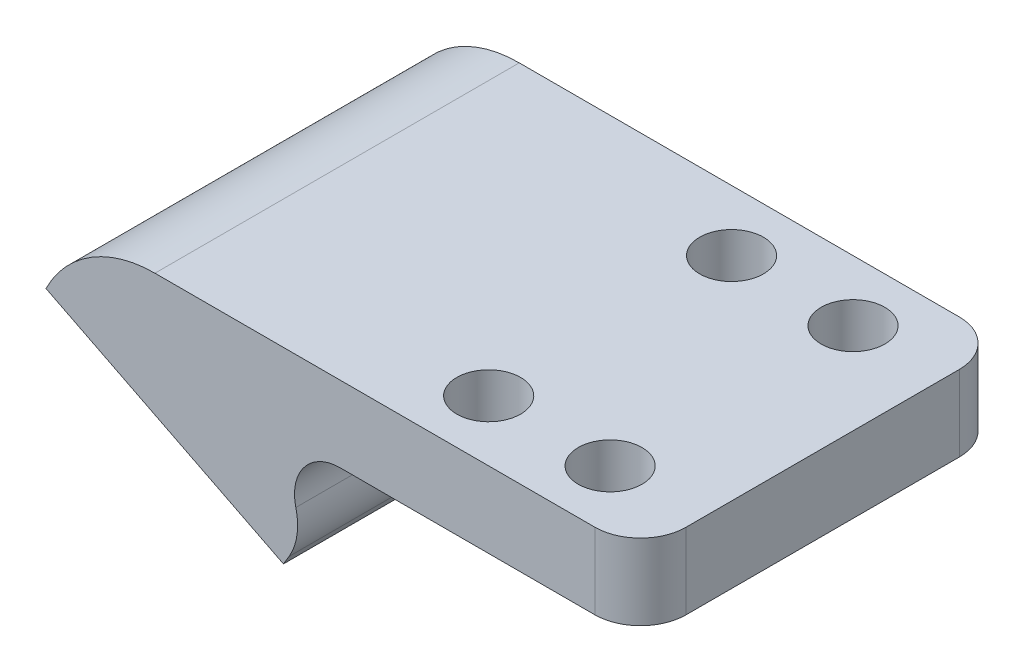
ISO-10303-21;
HEADER;
FILE_DESCRIPTION(('STEP AP214'),'2;1');
FILE_NAME('part.step','',(''),(''),'','','');
FILE_SCHEMA(('AUTOMOTIVE_DESIGN { 1 0 10303 214 1 1 1 1 }'));
ENDSEC;
DATA;
#1=APPLICATION_CONTEXT('core data for automotive mechanical design processes');
#2=APPLICATION_PROTOCOL_DEFINITION('international standard','automotive_design',2000,#1);
#3=PRODUCT_CONTEXT('',#1,'mechanical');
#4=PRODUCT('Part','Part','',(#3));
#5=PRODUCT_RELATED_PRODUCT_CATEGORY('part','',(#4));
#6=PRODUCT_DEFINITION_FORMATION('','',#4);
#7=PRODUCT_DEFINITION_CONTEXT('part definition',#1,'design');
#8=PRODUCT_DEFINITION('design','',#6,#7);
#9=PRODUCT_DEFINITION_SHAPE('','',#8);
#10=(LENGTH_UNIT() NAMED_UNIT(*) SI_UNIT(.MILLI.,.METRE.));
#11=(NAMED_UNIT(*) PLANE_ANGLE_UNIT() SI_UNIT($,.RADIAN.));
#12=(NAMED_UNIT(*) SI_UNIT($,.STERADIAN.) SOLID_ANGLE_UNIT());
#13=UNCERTAINTY_MEASURE_WITH_UNIT(LENGTH_MEASURE(1.E-05),#10,'distance_accuracy_value','');
#14=(GEOMETRIC_REPRESENTATION_CONTEXT(3) GLOBAL_UNCERTAINTY_ASSIGNED_CONTEXT((#13)) GLOBAL_UNIT_ASSIGNED_CONTEXT((#10,
#11,#12)) REPRESENTATION_CONTEXT('',''));
#15=CARTESIAN_POINT('',(0.,0.,0.));
#16=DIRECTION('',(0.,0.,1.));
#17=DIRECTION('',(1.,0.,0.));
#18=AXIS2_PLACEMENT_3D('',#15,#16,#17);
#19=CARTESIAN_POINT('',(-3.5827119850903,-7.10195779346765,0.));
#20=DIRECTION('',(-0.450402219937165,-0.892825761431464,0.));
#21=DIRECTION('',(0.892825761431464,-0.450402219937165,0.));
#22=AXIS2_PLACEMENT_3D('',#19,#20,#21);
#23=PLANE('',#22);
#24=DIRECTION('',(0.892825761431464,-0.450402219937165,0.));
#25=VECTOR('',#24,1.);
#26=CARTESIAN_POINT('',(-3.5827119850903,-7.10195779346765,24.));
#27=LINE('',#26,#25);
#28=CARTESIAN_POINT('',(-18.7230691559257,0.535871192842679,24.));
#29=VERTEX_POINT('',#28);
#30=CARTESIAN_POINT('',(-3.08050844509965,-7.35530351784442,24.));
#31=VERTEX_POINT('',#30);
#32=EDGE_CURVE('E201',#29,#31,#27,.T.);
#33=ORIENTED_EDGE('',*,*,#32,.F.);
#34=DIRECTION('',(0.,0.,1.));
#35=VECTOR('',#34,1.);
#36=CARTESIAN_POINT('',(-18.7230691559257,0.535871192842679,0.));
#37=LINE('',#36,#35);
#38=CARTESIAN_POINT('',(-18.7230691559257,0.535871192842679,0.));
#39=VERTEX_POINT('',#38);
#40=EDGE_CURVE('E218',#39,#29,#37,.T.);
#41=ORIENTED_EDGE('',*,*,#40,.F.);
#42=DIRECTION('',(0.892825761431464,-0.450402219937165,0.));
#43=VECTOR('',#42,1.);
#44=CARTESIAN_POINT('',(-3.5827119850903,-7.10195779346765,0.));
#45=LINE('',#44,#43);
#46=CARTESIAN_POINT('',(-3.08050844509965,-7.35530351784442,0.));
#47=VERTEX_POINT('',#46);
#48=EDGE_CURVE('E202',#39,#47,#45,.T.);
#49=ORIENTED_EDGE('',*,*,#48,.T.);
#50=DIRECTION('',(0.,0.,1.));
#51=VECTOR('',#50,1.);
#52=CARTESIAN_POINT('',(-3.08050844509965,-7.35530351784442,0.));
#53=LINE('',#52,#51);
#54=EDGE_CURVE('E211',#47,#31,#53,.T.);
#55=ORIENTED_EDGE('',*,*,#54,.T.);
#56=EDGE_LOOP('',(#33,#41,#49,#55));
#57=FACE_BOUND('',#56,.T.);
#58=DIRECTION('',(0.,0.,-1.));
#59=VECTOR('',#58,1.);
#60=CARTESIAN_POINT('',(-13.1338532040913,-2.28371061265796,17.));
#61=LINE('',#60,#59);
#62=CARTESIAN_POINT('',(-13.1338532040913,-2.28371061265796,17.));
#63=VERTEX_POINT('',#62);
#64=CARTESIAN_POINT('',(-13.1338532040913,-2.28371061265796,7.));
#65=VERTEX_POINT('',#64);
#66=EDGE_CURVE('E544',#63,#65,#61,.T.);
#67=ORIENTED_EDGE('',*,*,#66,.F.);
#68=CARTESIAN_POINT('',(-10.9017888005127,-3.40971616250087,17.));
#69=DIRECTION('',(-0.450402219937165,-0.892825761431464,0.));
#70=DIRECTION('',(0.892825761431464,-0.450402219937165,0.));
#71=AXIS2_PLACEMENT_3D('',#68,#69,#70);
#72=CIRCLE('',#71,2.5);
#73=CARTESIAN_POINT('',(-8.669724396934,-4.53572171234378,17.));
#74=VERTEX_POINT('',#73);
#75=EDGE_CURVE('E165',#74,#63,#72,.T.);
#76=ORIENTED_EDGE('',*,*,#75,.F.);
#77=DIRECTION('',(0.,0.,1.));
#78=VECTOR('',#77,1.);
#79=CARTESIAN_POINT('',(-8.669724396934,-4.53572171234378,17.));
#80=LINE('',#79,#78);
#81=CARTESIAN_POINT('',(-8.66972439693401,-4.53572171234379,7.));
#82=VERTEX_POINT('',#81);
#83=EDGE_CURVE('E161',#82,#74,#80,.T.);
#84=ORIENTED_EDGE('',*,*,#83,.F.);
#85=CARTESIAN_POINT('',(-10.9017888005127,-3.40971616250087,7.));
#86=DIRECTION('',(-0.450402219937165,-0.892825761431464,0.));
#87=DIRECTION('',(0.892825761431464,-0.450402219937165,0.));
#88=AXIS2_PLACEMENT_3D('',#85,#86,#87);
#89=CIRCLE('',#88,2.5);
#90=EDGE_CURVE('E541',#65,#82,#89,.T.);
#91=ORIENTED_EDGE('',*,*,#90,.F.);
#92=EDGE_LOOP('',(#67,#76,#84,#91));
#93=FACE_BOUND('',#92,.T.);
#94=ADVANCED_FACE('F35',(#57,#93),#23,.T.);
#95=CARTESIAN_POINT('',(-6.55963087060098,0.,24.));
#96=DIRECTION('',(0.,1.,0.));
#97=DIRECTION('',(0.,0.,1.));
#98=AXIS2_PLACEMENT_3D('',#95,#96,#97);
#99=PLANE('',#98);
#100=CARTESIAN_POINT('',(6.44036912939902,0.,4.));
#101=DIRECTION('',(0.,1.,0.));
#102=DIRECTION('',(0.,0.,1.));
#103=AXIS2_PLACEMENT_3D('',#100,#101,#102);
#104=CIRCLE('',#103,2.1);
#105=CARTESIAN_POINT('',(6.44036912939902,0.,6.1));
#106=VERTEX_POINT('',#105);
#107=EDGE_CURVE('E170',#106,#106,#104,.T.);
#108=ORIENTED_EDGE('',*,*,#107,.T.);
#109=EDGE_LOOP('',(#108));
#110=FACE_BOUND('',#109,.T.);
#111=CARTESIAN_POINT('',(14.440369129399,0.,4.));
#112=DIRECTION('',(0.,1.,0.));
#113=DIRECTION('',(0.,0.,1.));
#114=AXIS2_PLACEMENT_3D('',#111,#112,#113);
#115=CIRCLE('',#114,2.1);
#116=CARTESIAN_POINT('',(14.440369129399,0.,6.1));
#117=VERTEX_POINT('',#116);
#118=EDGE_CURVE('E180',#117,#117,#115,.T.);
#119=ORIENTED_EDGE('',*,*,#118,.T.);
#120=EDGE_LOOP('',(#119));
#121=FACE_BOUND('',#120,.T.);
#122=CARTESIAN_POINT('',(14.440369129399,0.,20.));
#123=DIRECTION('',(0.,1.,0.));
#124=DIRECTION('',(0.,0.,1.));
#125=AXIS2_PLACEMENT_3D('',#122,#123,#124);
#126=CIRCLE('',#125,2.1);
#127=CARTESIAN_POINT('',(14.440369129399,0.,22.1));
#128=VERTEX_POINT('',#127);
#129=EDGE_CURVE('E186',#128,#128,#126,.F.);
#130=ORIENTED_EDGE('',*,*,#129,.F.);
#131=EDGE_LOOP('',(#130));
#132=FACE_BOUND('',#131,.T.);
#133=CARTESIAN_POINT('',(6.44036912939902,0.,20.));
#134=DIRECTION('',(0.,1.,0.));
#135=DIRECTION('',(0.,0.,1.));
#136=AXIS2_PLACEMENT_3D('',#133,#134,#135);
#137=CIRCLE('',#136,2.1);
#138=CARTESIAN_POINT('',(6.44036912939902,0.,22.1));
#139=VERTEX_POINT('',#138);
#140=EDGE_CURVE('E192',#139,#139,#137,.T.);
#141=ORIENTED_EDGE('',*,*,#140,.T.);
#142=EDGE_LOOP('',(#141));
#143=FACE_BOUND('',#142,.T.);
#144=DIRECTION('',(1.,0.,0.));
#145=VECTOR('',#144,1.);
#146=CARTESIAN_POINT('',(-6.55963087060098,0.,0.));
#147=LINE('',#146,#145);
#148=CARTESIAN_POINT('',(0.647584166850476,0.,0.));
#149=VERTEX_POINT('',#148);
#150=CARTESIAN_POINT('',(17.440369129399,0.,0.));
#151=VERTEX_POINT('',#150);
#152=EDGE_CURVE('E221',#149,#151,#147,.T.);
#153=ORIENTED_EDGE('',*,*,#152,.T.);
#154=CARTESIAN_POINT('',(17.440369129399,0.,3.));
#155=DIRECTION('',(0.,1.,0.));
#156=DIRECTION('',(0.,0.,1.));
#157=AXIS2_PLACEMENT_3D('',#154,#155,#156);
#158=CIRCLE('',#157,3.);
#159=CARTESIAN_POINT('',(20.440369129399,0.,3.));
#160=VERTEX_POINT('',#159);
#161=EDGE_CURVE('E43',#151,#160,#158,.F.);
#162=ORIENTED_EDGE('',*,*,#161,.T.);
#163=DIRECTION('',(0.,0.,-1.));
#164=VECTOR('',#163,1.);
#165=CARTESIAN_POINT('',(20.440369129399,0.,0.));
#166=LINE('',#165,#164);
#167=CARTESIAN_POINT('',(20.440369129399,0.,21.));
#168=VERTEX_POINT('',#167);
#169=EDGE_CURVE('E198',#168,#160,#166,.T.);
#170=ORIENTED_EDGE('',*,*,#169,.F.);
#171=CARTESIAN_POINT('',(17.440369129399,0.,21.));
#172=DIRECTION('',(0.,1.,0.));
#173=DIRECTION('',(0.,0.,1.));
#174=AXIS2_PLACEMENT_3D('',#171,#172,#173);
#175=CIRCLE('',#174,3.);
#176=CARTESIAN_POINT('',(17.440369129399,0.,24.));
#177=VERTEX_POINT('',#176);
#178=EDGE_CURVE('E58',#168,#177,#175,.F.);
#179=ORIENTED_EDGE('',*,*,#178,.T.);
#180=DIRECTION('',(1.,0.,0.));
#181=VECTOR('',#180,1.);
#182=CARTESIAN_POINT('',(-6.55963087060098,0.,24.));
#183=LINE('',#182,#181);
#184=CARTESIAN_POINT('',(0.647584166850476,0.,24.));
#185=VERTEX_POINT('',#184);
#186=EDGE_CURVE('E223',#185,#177,#183,.T.);
#187=ORIENTED_EDGE('',*,*,#186,.F.);
#188=DIRECTION('',(0.,0.,-1.));
#189=VECTOR('',#188,1.);
#190=CARTESIAN_POINT('',(0.647584166850476,0.,24.));
#191=LINE('',#190,#189);
#192=EDGE_CURVE('E249',#185,#149,#191,.T.);
#193=ORIENTED_EDGE('',*,*,#192,.T.);
#194=EDGE_LOOP('',(#153,#162,#170,#179,#187,#193));
#195=FACE_BOUND('',#194,.T.);
#196=ADVANCED_FACE('F271',(#110,#121,#132,#143,#195),#99,.F.);
#197=CARTESIAN_POINT('',(-6.55963087060098,5.,24.));
#198=DIRECTION('',(0.,-1.,0.));
#199=DIRECTION('',(0.,0.,-1.));
#200=AXIS2_PLACEMENT_3D('',#197,#198,#199);
#201=PLANE('',#200);
#202=CARTESIAN_POINT('',(6.44036912939902,5.,4.));
#203=DIRECTION('',(0.,1.,0.));
#204=DIRECTION('',(0.,0.,1.));
#205=AXIS2_PLACEMENT_3D('',#202,#203,#204);
#206=CIRCLE('',#205,2.1);
#207=CARTESIAN_POINT('',(6.44036912939902,5.,6.1));
#208=VERTEX_POINT('',#207);
#209=EDGE_CURVE('E167',#208,#208,#206,.T.);
#210=ORIENTED_EDGE('',*,*,#209,.F.);
#211=EDGE_LOOP('',(#210));
#212=FACE_BOUND('',#211,.T.);
#213=CARTESIAN_POINT('',(14.440369129399,5.,4.));
#214=DIRECTION('',(0.,1.,0.));
#215=DIRECTION('',(0.,0.,1.));
#216=AXIS2_PLACEMENT_3D('',#213,#214,#215);
#217=CIRCLE('',#216,2.1);
#218=CARTESIAN_POINT('',(14.440369129399,5.,6.1));
#219=VERTEX_POINT('',#218);
#220=EDGE_CURVE('E177',#219,#219,#217,.T.);
#221=ORIENTED_EDGE('',*,*,#220,.F.);
#222=EDGE_LOOP('',(#221));
#223=FACE_BOUND('',#222,.T.);
#224=CARTESIAN_POINT('',(14.440369129399,5.,20.));
#225=DIRECTION('',(0.,1.,0.));
#226=DIRECTION('',(0.,0.,1.));
#227=AXIS2_PLACEMENT_3D('',#224,#225,#226);
#228=CIRCLE('',#227,2.1);
#229=CARTESIAN_POINT('',(14.440369129399,5.,22.1));
#230=VERTEX_POINT('',#229);
#231=EDGE_CURVE('E183',#230,#230,#228,.F.);
#232=ORIENTED_EDGE('',*,*,#231,.T.);
#233=EDGE_LOOP('',(#232));
#234=FACE_BOUND('',#233,.T.);
#235=CARTESIAN_POINT('',(6.44036912939902,5.,20.));
#236=DIRECTION('',(0.,1.,0.));
#237=DIRECTION('',(0.,0.,1.));
#238=AXIS2_PLACEMENT_3D('',#235,#236,#237);
#239=CIRCLE('',#238,2.1);
#240=CARTESIAN_POINT('',(6.44036912939902,5.,22.1));
#241=VERTEX_POINT('',#240);
#242=EDGE_CURVE('E189',#241,#241,#239,.T.);
#243=ORIENTED_EDGE('',*,*,#242,.F.);
#244=EDGE_LOOP('',(#243));
#245=FACE_BOUND('',#244,.T.);
#246=DIRECTION('',(0.,0.,1.));
#247=VECTOR('',#246,1.);
#248=CARTESIAN_POINT('',(20.440369129399,5.,0.));
#249=LINE('',#248,#247);
#250=CARTESIAN_POINT('',(20.440369129399,5.,3.));
#251=VERTEX_POINT('',#250);
#252=CARTESIAN_POINT('',(20.440369129399,5.,21.));
#253=VERTEX_POINT('',#252);
#254=EDGE_CURVE('E195',#251,#253,#249,.T.);
#255=ORIENTED_EDGE('',*,*,#254,.F.);
#256=CARTESIAN_POINT('',(17.440369129399,5.,3.));
#257=DIRECTION('',(0.,-1.,0.));
#258=DIRECTION('',(0.,0.,-1.));
#259=AXIS2_PLACEMENT_3D('',#256,#257,#258);
#260=CIRCLE('',#259,3.);
#261=CARTESIAN_POINT('',(17.440369129399,5.,0.));
#262=VERTEX_POINT('',#261);
#263=EDGE_CURVE('E266',#251,#262,#260,.F.);
#264=ORIENTED_EDGE('',*,*,#263,.T.);
#265=DIRECTION('',(-1.,0.,0.));
#266=VECTOR('',#265,1.);
#267=CARTESIAN_POINT('',(-6.55963087060098,5.,0.));
#268=LINE('',#267,#266);
#269=CARTESIAN_POINT('',(-11.5464888620744,5.,0.));
#270=VERTEX_POINT('',#269);
#271=EDGE_CURVE('E226',#262,#270,#268,.T.);
#272=ORIENTED_EDGE('',*,*,#271,.T.);
#273=DIRECTION('',(0.,0.,1.));
#274=VECTOR('',#273,1.);
#275=CARTESIAN_POINT('',(-11.5464888620744,5.,24.));
#276=LINE('',#275,#274);
#277=CARTESIAN_POINT('',(-11.5464888620744,5.,24.));
#278=VERTEX_POINT('',#277);
#279=EDGE_CURVE('E239',#270,#278,#276,.T.);
#280=ORIENTED_EDGE('',*,*,#279,.T.);
#281=DIRECTION('',(-1.,0.,0.));
#282=VECTOR('',#281,1.);
#283=CARTESIAN_POINT('',(-6.55963087060098,5.,24.));
#284=LINE('',#283,#282);
#285=CARTESIAN_POINT('',(17.440369129399,5.,24.));
#286=VERTEX_POINT('',#285);
#287=EDGE_CURVE('E225',#286,#278,#284,.T.);
#288=ORIENTED_EDGE('',*,*,#287,.F.);
#289=CARTESIAN_POINT('',(17.440369129399,5.,21.));
#290=DIRECTION('',(0.,-1.,0.));
#291=DIRECTION('',(0.,0.,-1.));
#292=AXIS2_PLACEMENT_3D('',#289,#290,#291);
#293=CIRCLE('',#292,3.);
#294=EDGE_CURVE('E264',#286,#253,#293,.F.);
#295=ORIENTED_EDGE('',*,*,#294,.T.);
#296=EDGE_LOOP('',(#255,#264,#272,#280,#288,#295));
#297=FACE_BOUND('',#296,.T.);
#298=ADVANCED_FACE('F283',(#212,#223,#234,#245,#297),#201,.F.);
#299=CARTESIAN_POINT('',(0.,0.,24.));
#300=DIRECTION('',(0.,0.,-1.));
#301=DIRECTION('',(-1.,0.,0.));
#302=AXIS2_PLACEMENT_3D('',#299,#300,#301);
#303=PLANE('',#302);
#304=ORIENTED_EDGE('',*,*,#186,.T.);
#305=DIRECTION('',(0.,-1.,0.));
#306=VECTOR('',#305,1.);
#307=CARTESIAN_POINT('',(17.440369129399,5.,24.));
#308=LINE('',#307,#306);
#309=EDGE_CURVE('E11',#177,#286,#308,.F.);
#310=ORIENTED_EDGE('',*,*,#309,.T.);
#311=ORIENTED_EDGE('',*,*,#287,.T.);
#312=CARTESIAN_POINT('',(-11.5464888620744,-3.,24.));
#313=DIRECTION('',(0.,0.,-1.));
#314=DIRECTION('',(-1.,0.,0.));
#315=AXIS2_PLACEMENT_3D('',#312,#313,#314);
#316=CIRCLE('',#315,8.);
#317=CARTESIAN_POINT('',(-18.6890949535261,0.603217759497323,24.));
#318=VERTEX_POINT('',#317);
#319=EDGE_CURVE('E242',#278,#318,#316,.F.);
#320=ORIENTED_EDGE('',*,*,#319,.T.);
#321=DIRECTION('',(-0.450402219937165,-0.892825761431464,0.));
#322=VECTOR('',#321,1.);
#323=CARTESIAN_POINT('',(-15.1403571708354,7.63782898631034,24.));
#324=LINE('',#323,#322);
#325=EDGE_CURVE('E206',#318,#29,#324,.T.);
#326=ORIENTED_EDGE('',*,*,#325,.T.);
#327=ORIENTED_EDGE('',*,*,#32,.T.);
#328=DIRECTION('',(0.514410733953749,0.857543932864763,0.));
#329=VECTOR('',#328,1.);
#330=CARTESIAN_POINT('',(0.979294379178216,-0.587444585686658,24.));
#331=LINE('',#330,#329);
#332=CARTESIAN_POINT('',(-2.71541169396758,-6.74667215932753,24.));
#333=VERTEX_POINT('',#332);
#334=EDGE_CURVE('E214',#31,#333,#331,.T.);
#335=ORIENTED_EDGE('',*,*,#334,.T.);
#336=CARTESIAN_POINT('',(-6.14558742542663,-4.68902922351253,24.));
#337=DIRECTION('',(0.,0.,-1.));
#338=DIRECTION('',(-1.,0.,0.));
#339=AXIS2_PLACEMENT_3D('',#336,#337,#338);
#340=CIRCLE('',#339,4.);
#341=CARTESIAN_POINT('',(-2.26377508698257,-3.72386966721965,24.));
#342=VERTEX_POINT('',#341);
#343=EDGE_CURVE('E234',#333,#342,#340,.F.);
#344=ORIENTED_EDGE('',*,*,#343,.T.);
#345=CARTESIAN_POINT('',(0.647584166850476,-3.,24.));
#346=DIRECTION('',(0.,0.,-1.));
#347=DIRECTION('',(-1.,0.,0.));
#348=AXIS2_PLACEMENT_3D('',#345,#346,#347);
#349=CIRCLE('',#348,3.);
#350=EDGE_CURVE('E256',#342,#185,#349,.T.);
#351=ORIENTED_EDGE('',*,*,#350,.T.);
#352=EDGE_LOOP('',(#304,#310,#311,#320,#326,#327,#335,#344,#351));
#353=FACE_BOUND('',#352,.T.);
#354=ADVANCED_FACE('F299',(#353),#303,.F.);
#355=CARTESIAN_POINT('',(0.,0.,0.));
#356=DIRECTION('',(0.,0.,-1.));
#357=DIRECTION('',(-1.,0.,0.));
#358=AXIS2_PLACEMENT_3D('',#355,#356,#357);
#359=PLANE('',#358);
#360=ORIENTED_EDGE('',*,*,#271,.F.);
#361=DIRECTION('',(0.,1.,0.));
#362=VECTOR('',#361,1.);
#363=CARTESIAN_POINT('',(17.440369129399,0.,0.));
#364=LINE('',#363,#362);
#365=EDGE_CURVE('E268',#262,#151,#364,.F.);
#366=ORIENTED_EDGE('',*,*,#365,.T.);
#367=ORIENTED_EDGE('',*,*,#152,.F.);
#368=CARTESIAN_POINT('',(0.647584166850476,-3.,0.));
#369=DIRECTION('',(0.,0.,-1.));
#370=DIRECTION('',(-1.,0.,0.));
#371=AXIS2_PLACEMENT_3D('',#368,#369,#370);
#372=CIRCLE('',#371,3.);
#373=CARTESIAN_POINT('',(-2.26377508698257,-3.72386966721965,0.));
#374=VERTEX_POINT('',#373);
#375=EDGE_CURVE('E254',#149,#374,#372,.F.);
#376=ORIENTED_EDGE('',*,*,#375,.T.);
#377=CARTESIAN_POINT('',(-6.14558742542663,-4.68902922351253,0.));
#378=DIRECTION('',(0.,0.,-1.));
#379=DIRECTION('',(-1.,0.,0.));
#380=AXIS2_PLACEMENT_3D('',#377,#378,#379);
#381=CIRCLE('',#380,4.);
#382=CARTESIAN_POINT('',(-2.71541169396758,-6.74667215932753,0.));
#383=VERTEX_POINT('',#382);
#384=EDGE_CURVE('E237',#374,#383,#381,.T.);
#385=ORIENTED_EDGE('',*,*,#384,.T.);
#386=DIRECTION('',(0.514410733953749,0.857543932864763,0.));
#387=VECTOR('',#386,1.);
#388=CARTESIAN_POINT('',(0.979294379178216,-0.587444585686658,0.));
#389=LINE('',#388,#387);
#390=EDGE_CURVE('E205',#47,#383,#389,.T.);
#391=ORIENTED_EDGE('',*,*,#390,.F.);
#392=ORIENTED_EDGE('',*,*,#48,.F.);
#393=DIRECTION('',(-0.450402219937165,-0.892825761431464,0.));
#394=VECTOR('',#393,1.);
#395=CARTESIAN_POINT('',(-15.1403571708354,7.63782898631034,0.));
#396=LINE('',#395,#394);
#397=CARTESIAN_POINT('',(-18.6890949535261,0.603217759497323,0.));
#398=VERTEX_POINT('',#397);
#399=EDGE_CURVE('E209',#398,#39,#396,.T.);
#400=ORIENTED_EDGE('',*,*,#399,.F.);
#401=CARTESIAN_POINT('',(-11.5464888620744,-3.,0.));
#402=DIRECTION('',(0.,0.,-1.));
#403=DIRECTION('',(-1.,0.,0.));
#404=AXIS2_PLACEMENT_3D('',#401,#402,#403);
#405=CIRCLE('',#404,8.);
#406=EDGE_CURVE('E246',#398,#270,#405,.T.);
#407=ORIENTED_EDGE('',*,*,#406,.T.);
#408=EDGE_LOOP('',(#360,#366,#367,#376,#385,#391,#392,#400,#407));
#409=FACE_BOUND('',#408,.T.);
#410=ADVANCED_FACE('F285',(#409),#359,.T.);
#411=CARTESIAN_POINT('',(-15.1403571708354,7.63782898631034,0.));
#412=DIRECTION('',(-0.892825761431464,0.450402219937165,0.));
#413=DIRECTION('',(-0.450402219937165,-0.892825761431464,0.));
#414=AXIS2_PLACEMENT_3D('',#411,#412,#413);
#415=PLANE('',#414);
#416=ORIENTED_EDGE('',*,*,#325,.F.);
#417=DIRECTION('',(0.,0.,1.));
#418=VECTOR('',#417,1.);
#419=CARTESIAN_POINT('',(-18.6890949535261,0.603217759497324,0.));
#420=LINE('',#419,#418);
#421=EDGE_CURVE('E244',#318,#398,#420,.F.);
#422=ORIENTED_EDGE('',*,*,#421,.T.);
#423=ORIENTED_EDGE('',*,*,#399,.T.);
#424=ORIENTED_EDGE('',*,*,#40,.T.);
#425=EDGE_LOOP('',(#416,#422,#423,#424));
#426=FACE_BOUND('',#425,.T.);
#427=ADVANCED_FACE('F319',(#426),#415,.T.);
#428=CARTESIAN_POINT('',(0.979294379178216,-0.587444585686658,0.));
#429=DIRECTION('',(0.857543932864763,-0.514410733953749,0.));
#430=DIRECTION('',(0.514410733953749,0.857543932864763,0.));
#431=AXIS2_PLACEMENT_3D('',#428,#429,#430);
#432=PLANE('',#431);
#433=ORIENTED_EDGE('',*,*,#390,.T.);
#434=DIRECTION('',(0.,0.,1.));
#435=VECTOR('',#434,1.);
#436=CARTESIAN_POINT('',(-2.71541169396758,-6.74667215932753,24.));
#437=LINE('',#436,#435);
#438=EDGE_CURVE('E228',#383,#333,#437,.T.);
#439=ORIENTED_EDGE('',*,*,#438,.T.);
#440=ORIENTED_EDGE('',*,*,#334,.F.);
#441=ORIENTED_EDGE('',*,*,#54,.F.);
#442=EDGE_LOOP('',(#433,#439,#440,#441));
#443=FACE_BOUND('',#442,.T.);
#444=ADVANCED_FACE('F312',(#443),#432,.T.);
#445=CARTESIAN_POINT('',(-6.14558742542663,-4.68902922351253,0.));
#446=DIRECTION('',(0.,0.,-1.));
#447=DIRECTION('',(-1.,0.,0.));
#448=AXIS2_PLACEMENT_3D('',#445,#446,#447);
#449=CYLINDRICAL_SURFACE('',#448,4.);
#450=ORIENTED_EDGE('',*,*,#384,.F.);
#451=DIRECTION('',(0.,0.,-1.));
#452=VECTOR('',#451,1.);
#453=CARTESIAN_POINT('',(-2.26377508698257,-3.72386966721965,0.));
#454=LINE('',#453,#452);
#455=EDGE_CURVE('E252',#374,#342,#454,.F.);
#456=ORIENTED_EDGE('',*,*,#455,.T.);
#457=ORIENTED_EDGE('',*,*,#343,.F.);
#458=ORIENTED_EDGE('',*,*,#438,.F.);
#459=EDGE_LOOP('',(#450,#456,#457,#458));
#460=FACE_BOUND('',#459,.T.);
#461=ADVANCED_FACE('F309',(#460),#449,.T.);
#462=CARTESIAN_POINT('',(-11.5464888620744,-3.,24.));
#463=DIRECTION('',(0.,0.,-1.));
#464=DIRECTION('',(-1.,0.,0.));
#465=AXIS2_PLACEMENT_3D('',#462,#463,#464);
#466=CYLINDRICAL_SURFACE('',#465,8.);
#467=ORIENTED_EDGE('',*,*,#406,.F.);
#468=ORIENTED_EDGE('',*,*,#421,.F.);
#469=ORIENTED_EDGE('',*,*,#319,.F.);
#470=ORIENTED_EDGE('',*,*,#279,.F.);
#471=EDGE_LOOP('',(#467,#468,#469,#470));
#472=FACE_BOUND('',#471,.T.);
#473=ADVANCED_FACE('F293',(#472),#466,.T.);
#474=CARTESIAN_POINT('',(0.647584166850476,-3.,0.));
#475=DIRECTION('',(0.,0.,-1.));
#476=DIRECTION('',(-1.,0.,0.));
#477=AXIS2_PLACEMENT_3D('',#474,#475,#476);
#478=CYLINDRICAL_SURFACE('',#477,3.);
#479=ORIENTED_EDGE('',*,*,#350,.F.);
#480=ORIENTED_EDGE('',*,*,#455,.F.);
#481=ORIENTED_EDGE('',*,*,#375,.F.);
#482=ORIENTED_EDGE('',*,*,#192,.F.);
#483=EDGE_LOOP('',(#479,#480,#481,#482));
#484=FACE_BOUND('',#483,.T.);
#485=ADVANCED_FACE('F303',(#484),#478,.F.);
#486=CARTESIAN_POINT('',(20.440369129399,0.,0.));
#487=DIRECTION('',(1.,0.,0.));
#488=DIRECTION('',(0.,0.,-1.));
#489=AXIS2_PLACEMENT_3D('',#486,#487,#488);
#490=PLANE('',#489);
#491=ORIENTED_EDGE('',*,*,#169,.T.);
#492=DIRECTION('',(0.,1.,0.));
#493=VECTOR('',#492,1.);
#494=CARTESIAN_POINT('',(20.440369129399,0.,3.));
#495=LINE('',#494,#493);
#496=EDGE_CURVE('E261',#160,#251,#495,.T.);
#497=ORIENTED_EDGE('',*,*,#496,.T.);
#498=ORIENTED_EDGE('',*,*,#254,.T.);
#499=DIRECTION('',(0.,-1.,0.));
#500=VECTOR('',#499,1.);
#501=CARTESIAN_POINT('',(20.440369129399,0.,21.));
#502=LINE('',#501,#500);
#503=EDGE_CURVE('E258',#253,#168,#502,.T.);
#504=ORIENTED_EDGE('',*,*,#503,.T.);
#505=EDGE_LOOP('',(#491,#497,#498,#504));
#506=FACE_BOUND('',#505,.T.);
#507=ADVANCED_FACE('F277',(#506),#490,.T.);
#508=CARTESIAN_POINT('',(6.44036912939902,-5.,20.));
#509=DIRECTION('',(0.,1.,0.));
#510=DIRECTION('',(0.,0.,1.));
#511=AXIS2_PLACEMENT_3D('',#508,#509,#510);
#512=CYLINDRICAL_SURFACE('',#511,2.1);
#513=ORIENTED_EDGE('',*,*,#242,.T.);
#514=EDGE_LOOP('',(#513));
#515=FACE_BOUND('',#514,.T.);
#516=ORIENTED_EDGE('',*,*,#140,.F.);
#517=EDGE_LOOP('',(#516));
#518=FACE_BOUND('',#517,.T.);
#519=ADVANCED_FACE('F368',(#515,#518),#512,.F.);
#520=CARTESIAN_POINT('',(14.440369129399,-5.,20.));
#521=DIRECTION('',(0.,1.,0.));
#522=DIRECTION('',(0.,0.,1.));
#523=AXIS2_PLACEMENT_3D('',#520,#521,#522);
#524=CYLINDRICAL_SURFACE('',#523,2.1);
#525=ORIENTED_EDGE('',*,*,#231,.F.);
#526=EDGE_LOOP('',(#525));
#527=FACE_BOUND('',#526,.T.);
#528=ORIENTED_EDGE('',*,*,#129,.T.);
#529=EDGE_LOOP('',(#528));
#530=FACE_BOUND('',#529,.T.);
#531=ADVANCED_FACE('F359',(#527,#530),#524,.F.);
#532=CARTESIAN_POINT('',(14.440369129399,-5.,4.));
#533=DIRECTION('',(0.,1.,0.));
#534=DIRECTION('',(0.,0.,1.));
#535=AXIS2_PLACEMENT_3D('',#532,#533,#534);
#536=CYLINDRICAL_SURFACE('',#535,2.1);
#537=ORIENTED_EDGE('',*,*,#220,.T.);
#538=EDGE_LOOP('',(#537));
#539=FACE_BOUND('',#538,.T.);
#540=ORIENTED_EDGE('',*,*,#118,.F.);
#541=EDGE_LOOP('',(#540));
#542=FACE_BOUND('',#541,.T.);
#543=ADVANCED_FACE('F353',(#539,#542),#536,.F.);
#544=CARTESIAN_POINT('',(6.44036912939902,-5.,4.));
#545=DIRECTION('',(0.,1.,0.));
#546=DIRECTION('',(0.,0.,1.));
#547=AXIS2_PLACEMENT_3D('',#544,#545,#546);
#548=CYLINDRICAL_SURFACE('',#547,2.1);
#549=ORIENTED_EDGE('',*,*,#209,.T.);
#550=EDGE_LOOP('',(#549));
#551=FACE_BOUND('',#550,.T.);
#552=ORIENTED_EDGE('',*,*,#107,.F.);
#553=EDGE_LOOP('',(#552));
#554=FACE_BOUND('',#553,.T.);
#555=ADVANCED_FACE('F348',(#551,#554),#548,.F.);
#556=CARTESIAN_POINT('',(17.440369129399,0.,3.));
#557=DIRECTION('',(0.,1.,0.));
#558=DIRECTION('',(0.,0.,1.));
#559=AXIS2_PLACEMENT_3D('',#556,#557,#558);
#560=CYLINDRICAL_SURFACE('',#559,3.);
#561=ORIENTED_EDGE('',*,*,#161,.F.);
#562=ORIENTED_EDGE('',*,*,#365,.F.);
#563=ORIENTED_EDGE('',*,*,#263,.F.);
#564=ORIENTED_EDGE('',*,*,#496,.F.);
#565=EDGE_LOOP('',(#561,#562,#563,#564));
#566=FACE_BOUND('',#565,.T.);
#567=ADVANCED_FACE('F280',(#566),#560,.T.);
#568=CARTESIAN_POINT('',(17.440369129399,0.,21.));
#569=DIRECTION('',(0.,1.,0.));
#570=DIRECTION('',(0.,0.,1.));
#571=AXIS2_PLACEMENT_3D('',#568,#569,#570);
#572=CYLINDRICAL_SURFACE('',#571,3.);
#573=ORIENTED_EDGE('',*,*,#294,.F.);
#574=ORIENTED_EDGE('',*,*,#309,.F.);
#575=ORIENTED_EDGE('',*,*,#178,.F.);
#576=ORIENTED_EDGE('',*,*,#503,.F.);
#577=EDGE_LOOP('',(#573,#574,#575,#576));
#578=FACE_BOUND('',#577,.T.);
#579=ADVANCED_FACE('F37',(#578),#572,.T.);
#580=CARTESIAN_POINT('',(-13.1537999001985,-7.87384496965819,17.));
#581=DIRECTION('',(0.450402219937165,0.892825761431464,0.));
#582=DIRECTION('',(-0.892825761431464,0.450402219937165,0.));
#583=AXIS2_PLACEMENT_3D('',#580,#581,#582);
#584=CYLINDRICAL_SURFACE('',#583,2.5);
#585=ORIENTED_EDGE('',*,*,#75,.T.);
#586=DIRECTION('',(0.450402219937165,0.892825761431464,0.));
#587=VECTOR('',#586,1.);
#588=CARTESIAN_POINT('',(-15.3858643037772,-6.74783941981528,17.));
#589=LINE('',#588,#587);
#590=CARTESIAN_POINT('',(-15.3858643037772,-6.74783941981528,17.));
#591=VERTEX_POINT('',#590);
#592=EDGE_CURVE('E146',#591,#63,#589,.T.);
#593=ORIENTED_EDGE('',*,*,#592,.F.);
#594=CARTESIAN_POINT('',(-13.1537999001985,-7.87384496965819,17.));
#595=DIRECTION('',(-0.450402219937165,-0.892825761431464,0.));
#596=DIRECTION('',(0.892825761431464,-0.450402219937165,0.));
#597=AXIS2_PLACEMENT_3D('',#594,#595,#596);
#598=CIRCLE('',#597,2.5);
#599=CARTESIAN_POINT('',(-10.9217354966198,-8.9998505195011,17.));
#600=VERTEX_POINT('',#599);
#601=EDGE_CURVE('E153',#600,#591,#598,.T.);
#602=ORIENTED_EDGE('',*,*,#601,.F.);
#603=DIRECTION('',(0.450402219937165,0.892825761431464,0.));
#604=VECTOR('',#603,1.);
#605=CARTESIAN_POINT('',(-10.9217354966198,-8.9998505195011,17.));
#606=LINE('',#605,#604);
#607=EDGE_CURVE('E539',#600,#74,#606,.T.);
#608=ORIENTED_EDGE('',*,*,#607,.T.);
#609=EDGE_LOOP('',(#585,#593,#602,#608));
#610=FACE_BOUND('',#609,.T.);
#611=ADVANCED_FACE('F163',(#610),#584,.T.);
#612=CARTESIAN_POINT('',(-15.3858643037772,-6.74783941981528,17.));
#613=DIRECTION('',(0.892825761431464,-0.450402219937165,0.));
#614=DIRECTION('',(0.450402219937165,0.892825761431464,0.));
#615=AXIS2_PLACEMENT_3D('',#612,#613,#614);
#616=PLANE('',#615);
#617=ORIENTED_EDGE('',*,*,#66,.T.);
#618=DIRECTION('',(0.450402219937165,0.892825761431464,0.));
#619=VECTOR('',#618,1.);
#620=CARTESIAN_POINT('',(-15.3858643037772,-6.74783941981528,7.));
#621=LINE('',#620,#619);
#622=CARTESIAN_POINT('',(-15.3858643037772,-6.74783941981528,7.));
#623=VERTEX_POINT('',#622);
#624=EDGE_CURVE('E149',#623,#65,#621,.T.);
#625=ORIENTED_EDGE('',*,*,#624,.F.);
#626=DIRECTION('',(0.,0.,-1.));
#627=VECTOR('',#626,1.);
#628=CARTESIAN_POINT('',(-15.3858643037772,-6.74783941981528,17.));
#629=LINE('',#628,#627);
#630=EDGE_CURVE('E142',#591,#623,#629,.T.);
#631=ORIENTED_EDGE('',*,*,#630,.F.);
#632=ORIENTED_EDGE('',*,*,#592,.T.);
#633=EDGE_LOOP('',(#617,#625,#631,#632));
#634=FACE_BOUND('',#633,.T.);
#635=ADVANCED_FACE('F144',(#634),#616,.F.);
#636=CARTESIAN_POINT('',(-13.1537999001985,-7.87384496965819,7.));
#637=DIRECTION('',(0.450402219937165,0.892825761431464,0.));
#638=DIRECTION('',(-0.892825761431464,0.450402219937165,0.));
#639=AXIS2_PLACEMENT_3D('',#636,#637,#638);
#640=CYLINDRICAL_SURFACE('',#639,2.5);
#641=ORIENTED_EDGE('',*,*,#90,.T.);
#642=DIRECTION('',(0.450402219937165,0.892825761431464,0.));
#643=VECTOR('',#642,1.);
#644=CARTESIAN_POINT('',(-10.9217354966198,-8.9998505195011,7.));
#645=LINE('',#644,#643);
#646=CARTESIAN_POINT('',(-10.9217354966198,-8.9998505195011,7.));
#647=VERTEX_POINT('',#646);
#648=EDGE_CURVE('E50',#647,#82,#645,.T.);
#649=ORIENTED_EDGE('',*,*,#648,.F.);
#650=CARTESIAN_POINT('',(-13.1537999001985,-7.87384496965819,7.));
#651=DIRECTION('',(-0.450402219937165,-0.892825761431464,0.));
#652=DIRECTION('',(0.892825761431464,-0.450402219937165,0.));
#653=AXIS2_PLACEMENT_3D('',#650,#651,#652);
#654=CIRCLE('',#653,2.5);
#655=EDGE_CURVE('E152',#623,#647,#654,.T.);
#656=ORIENTED_EDGE('',*,*,#655,.F.);
#657=ORIENTED_EDGE('',*,*,#624,.T.);
#658=EDGE_LOOP('',(#641,#649,#656,#657));
#659=FACE_BOUND('',#658,.T.);
#660=ADVANCED_FACE('F508',(#659),#640,.T.);
#661=CARTESIAN_POINT('',(-10.9217354966198,-8.9998505195011,17.));
#662=DIRECTION('',(-0.892825761431464,0.450402219937165,0.));
#663=DIRECTION('',(-0.450402219937165,-0.892825761431464,0.));
#664=AXIS2_PLACEMENT_3D('',#661,#662,#663);
#665=PLANE('',#664);
#666=ORIENTED_EDGE('',*,*,#83,.T.);
#667=ORIENTED_EDGE('',*,*,#607,.F.);
#668=DIRECTION('',(0.,0.,1.));
#669=VECTOR('',#668,1.);
#670=CARTESIAN_POINT('',(-10.9217354966198,-8.9998505195011,17.));
#671=LINE('',#670,#669);
#672=EDGE_CURVE('E157',#647,#600,#671,.T.);
#673=ORIENTED_EDGE('',*,*,#672,.F.);
#674=ORIENTED_EDGE('',*,*,#648,.T.);
#675=EDGE_LOOP('',(#666,#667,#673,#674));
#676=FACE_BOUND('',#675,.T.);
#677=ADVANCED_FACE('F515',(#676),#665,.F.);
#678=CARTESIAN_POINT('',(-13.1537999001985,-7.87384496965819,17.));
#679=DIRECTION('',(-0.450402219937165,-0.892825761431464,0.));
#680=DIRECTION('',(0.892825761431464,-0.450402219937165,0.));
#681=AXIS2_PLACEMENT_3D('',#678,#679,#680);
#682=PLANE('',#681);
#683=ORIENTED_EDGE('',*,*,#601,.T.);
#684=ORIENTED_EDGE('',*,*,#630,.T.);
#685=ORIENTED_EDGE('',*,*,#655,.T.);
#686=ORIENTED_EDGE('',*,*,#672,.T.);
#687=EDGE_LOOP('',(#683,#684,#685,#686));
#688=FACE_BOUND('',#687,.T.);
#689=ADVANCED_FACE('F156',(#688),#682,.T.);
#690=CLOSED_SHELL('',(#94,#196,#298,#354,#410,#427,#444,#461,#473,#485,#507,#519,#531,#543,#555,
#567,#579,#611,#635,#660,#677,#689));
#691=MANIFOLD_SOLID_BREP('B2',#690);
#692=ADVANCED_BREP_SHAPE_REPRESENTATION('',(#18,#691),#14);
#693=SHAPE_DEFINITION_REPRESENTATION(#9,#692);
ENDSEC;
END-ISO-10303-21;
